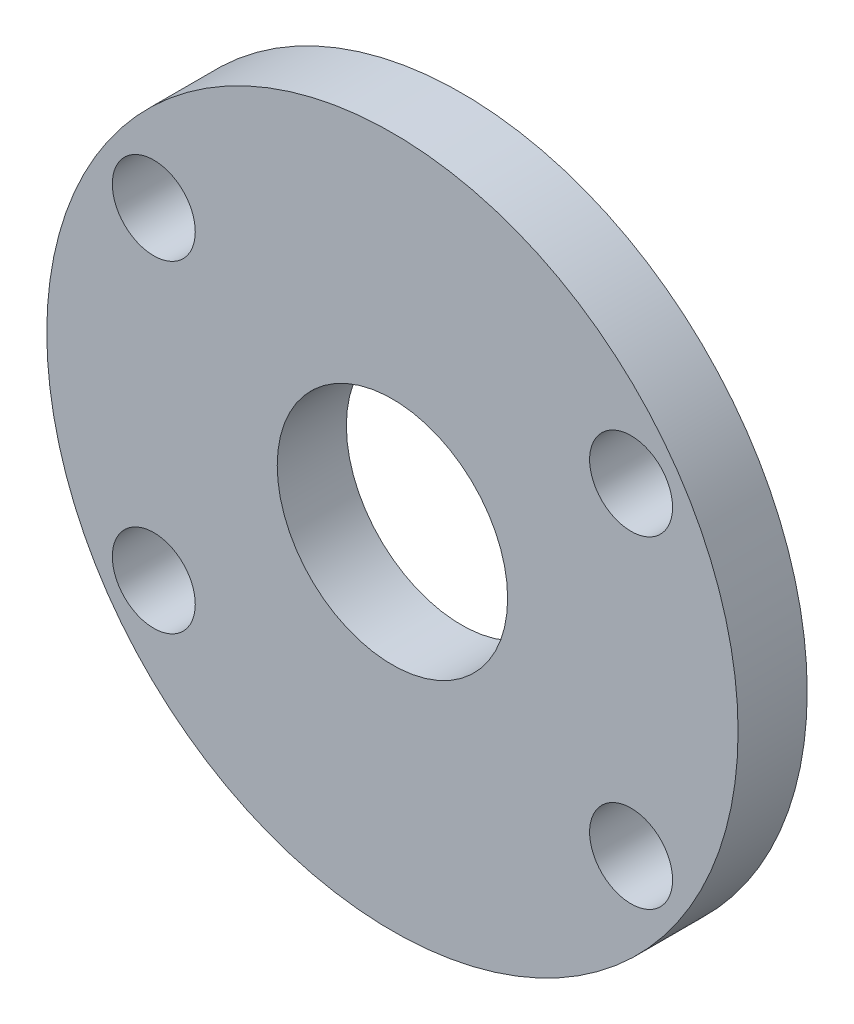
ISO-10303-21;
HEADER;
FILE_DESCRIPTION(('STEP AP214'),'2;1');
FILE_NAME('part.step','',(''),(''),'','','');
FILE_SCHEMA(('AUTOMOTIVE_DESIGN { 1 0 10303 214 1 1 1 1 }'));
ENDSEC;
DATA;
#1=APPLICATION_CONTEXT('core data for automotive mechanical design processes');
#2=APPLICATION_PROTOCOL_DEFINITION('international standard','automotive_design',2000,#1);
#3=PRODUCT_CONTEXT('',#1,'mechanical');
#4=PRODUCT('Part','Part','',(#3));
#5=PRODUCT_RELATED_PRODUCT_CATEGORY('part','',(#4));
#6=PRODUCT_DEFINITION_FORMATION('','',#4);
#7=PRODUCT_DEFINITION_CONTEXT('part definition',#1,'design');
#8=PRODUCT_DEFINITION('design','',#6,#7);
#9=PRODUCT_DEFINITION_SHAPE('','',#8);
#10=(LENGTH_UNIT() NAMED_UNIT(*) SI_UNIT(.MILLI.,.METRE.));
#11=(NAMED_UNIT(*) PLANE_ANGLE_UNIT() SI_UNIT($,.RADIAN.));
#12=(NAMED_UNIT(*) SI_UNIT($,.STERADIAN.) SOLID_ANGLE_UNIT());
#13=UNCERTAINTY_MEASURE_WITH_UNIT(LENGTH_MEASURE(1.E-05),#10,'distance_accuracy_value','');
#14=(GEOMETRIC_REPRESENTATION_CONTEXT(3) GLOBAL_UNCERTAINTY_ASSIGNED_CONTEXT((#13)) GLOBAL_UNIT_ASSIGNED_CONTEXT((#10,
#11,#12)) REPRESENTATION_CONTEXT('',''));
#15=CARTESIAN_POINT('',(0.,0.,0.));
#16=DIRECTION('',(0.,0.,1.));
#17=DIRECTION('',(1.,0.,0.));
#18=AXIS2_PLACEMENT_3D('',#15,#16,#17);
#19=CARTESIAN_POINT('',(0.,0.,3.));
#20=DIRECTION('',(0.,0.,-1.));
#21=DIRECTION('',(-1.,0.,0.));
#22=AXIS2_PLACEMENT_3D('',#19,#20,#21);
#23=CYLINDRICAL_SURFACE('',#22,15.);
#24=CARTESIAN_POINT('',(0.,0.,3.));
#25=DIRECTION('',(0.,0.,1.));
#26=DIRECTION('',(1.,0.,0.));
#27=AXIS2_PLACEMENT_3D('',#24,#25,#26);
#28=CIRCLE('',#27,15.);
#29=CARTESIAN_POINT('',(15.,0.,3.));
#30=VERTEX_POINT('',#29);
#31=EDGE_CURVE('E10',#30,#30,#28,.T.);
#32=ORIENTED_EDGE('',*,*,#31,.F.);
#33=EDGE_LOOP('',(#32));
#34=FACE_BOUND('',#33,.T.);
#35=CARTESIAN_POINT('',(0.,0.,0.));
#36=DIRECTION('',(0.,0.,1.));
#37=DIRECTION('',(1.,0.,0.));
#38=AXIS2_PLACEMENT_3D('',#35,#36,#37);
#39=CIRCLE('',#38,15.);
#40=CARTESIAN_POINT('',(15.,0.,0.));
#41=VERTEX_POINT('',#40);
#42=EDGE_CURVE('E36',#41,#41,#39,.T.);
#43=ORIENTED_EDGE('',*,*,#42,.T.);
#44=EDGE_LOOP('',(#43));
#45=FACE_BOUND('',#44,.T.);
#46=ADVANCED_FACE('F33',(#34,#45),#23,.T.);
#47=CARTESIAN_POINT('',(0.,0.,3.));
#48=DIRECTION('',(0.,0.,1.));
#49=DIRECTION('',(1.,0.,0.));
#50=AXIS2_PLACEMENT_3D('',#47,#48,#49);
#51=PLANE('',#50);
#52=CARTESIAN_POINT('',(-10.356157588604,7.,3.));
#53=DIRECTION('',(0.,0.,1.));
#54=DIRECTION('',(-1.,0.,0.));
#55=AXIS2_PLACEMENT_3D('',#52,#53,#54);
#56=CIRCLE('',#55,1.8);
#57=CARTESIAN_POINT('',(-8.55615758860399,7.,3.));
#58=VERTEX_POINT('',#57);
#59=EDGE_CURVE('E61',#58,#58,#56,.T.);
#60=ORIENTED_EDGE('',*,*,#59,.F.);
#61=EDGE_LOOP('',(#60));
#62=FACE_BOUND('',#61,.T.);
#63=CARTESIAN_POINT('',(10.356157588604,7.,3.));
#64=DIRECTION('',(0.,0.,1.));
#65=DIRECTION('',(-1.,0.,0.));
#66=AXIS2_PLACEMENT_3D('',#63,#64,#65);
#67=CIRCLE('',#66,1.8);
#68=CARTESIAN_POINT('',(12.156157588604,7.,3.));
#69=VERTEX_POINT('',#68);
#70=EDGE_CURVE('E60',#69,#69,#67,.T.);
#71=ORIENTED_EDGE('',*,*,#70,.F.);
#72=EDGE_LOOP('',(#71));
#73=FACE_BOUND('',#72,.T.);
#74=CARTESIAN_POINT('',(10.356157588604,-7.,3.));
#75=DIRECTION('',(0.,0.,1.));
#76=DIRECTION('',(1.,0.,0.));
#77=AXIS2_PLACEMENT_3D('',#74,#75,#76);
#78=CIRCLE('',#77,1.8);
#79=CARTESIAN_POINT('',(12.156157588604,-7.,3.));
#80=VERTEX_POINT('',#79);
#81=EDGE_CURVE('E67',#80,#80,#78,.T.);
#82=ORIENTED_EDGE('',*,*,#81,.F.);
#83=EDGE_LOOP('',(#82));
#84=FACE_BOUND('',#83,.T.);
#85=CARTESIAN_POINT('',(-10.356157588604,-7.,3.));
#86=DIRECTION('',(0.,0.,1.));
#87=DIRECTION('',(1.,0.,0.));
#88=AXIS2_PLACEMENT_3D('',#85,#86,#87);
#89=CIRCLE('',#88,1.8);
#90=CARTESIAN_POINT('',(-8.55615758860399,-7.,3.));
#91=VERTEX_POINT('',#90);
#92=EDGE_CURVE('E53',#91,#91,#89,.T.);
#93=ORIENTED_EDGE('',*,*,#92,.F.);
#94=EDGE_LOOP('',(#93));
#95=FACE_BOUND('',#94,.T.);
#96=CARTESIAN_POINT('',(0.,0.,3.));
#97=DIRECTION('',(0.,0.,1.));
#98=DIRECTION('',(1.,0.,0.));
#99=AXIS2_PLACEMENT_3D('',#96,#97,#98);
#100=CIRCLE('',#99,5.);
#101=CARTESIAN_POINT('',(5.,0.,3.));
#102=VERTEX_POINT('',#101);
#103=EDGE_CURVE('E47',#102,#102,#100,.T.);
#104=ORIENTED_EDGE('',*,*,#103,.F.);
#105=EDGE_LOOP('',(#104));
#106=FACE_BOUND('',#105,.T.);
#107=ORIENTED_EDGE('',*,*,#31,.T.);
#108=EDGE_LOOP('',(#107));
#109=FACE_BOUND('',#108,.T.);
#110=ADVANCED_FACE('F78',(#62,#73,#84,#95,#106,#109),#51,.T.);
#111=CARTESIAN_POINT('',(0.,0.,0.));
#112=DIRECTION('',(0.,0.,1.));
#113=DIRECTION('',(1.,0.,0.));
#114=AXIS2_PLACEMENT_3D('',#111,#112,#113);
#115=PLANE('',#114);
#116=CARTESIAN_POINT('',(-10.356157588604,7.,0.));
#117=DIRECTION('',(0.,0.,1.));
#118=DIRECTION('',(1.,0.,0.));
#119=AXIS2_PLACEMENT_3D('',#116,#117,#118);
#120=CIRCLE('',#119,1.8);
#121=CARTESIAN_POINT('',(-8.55615758860399,7.,0.));
#122=VERTEX_POINT('',#121);
#123=EDGE_CURVE('E57',#122,#122,#120,.F.);
#124=ORIENTED_EDGE('',*,*,#123,.F.);
#125=EDGE_LOOP('',(#124));
#126=FACE_BOUND('',#125,.T.);
#127=CARTESIAN_POINT('',(10.356157588604,7.,0.));
#128=DIRECTION('',(0.,0.,1.));
#129=DIRECTION('',(1.,0.,0.));
#130=AXIS2_PLACEMENT_3D('',#127,#128,#129);
#131=CIRCLE('',#130,1.8);
#132=CARTESIAN_POINT('',(12.156157588604,7.,0.));
#133=VERTEX_POINT('',#132);
#134=EDGE_CURVE('E64',#133,#133,#131,.F.);
#135=ORIENTED_EDGE('',*,*,#134,.F.);
#136=EDGE_LOOP('',(#135));
#137=FACE_BOUND('',#136,.T.);
#138=CARTESIAN_POINT('',(10.356157588604,-7.,0.));
#139=DIRECTION('',(0.,0.,1.));
#140=DIRECTION('',(1.,0.,0.));
#141=AXIS2_PLACEMENT_3D('',#138,#139,#140);
#142=CIRCLE('',#141,1.8);
#143=CARTESIAN_POINT('',(12.156157588604,-7.,0.));
#144=VERTEX_POINT('',#143);
#145=EDGE_CURVE('E56',#144,#144,#142,.F.);
#146=ORIENTED_EDGE('',*,*,#145,.F.);
#147=EDGE_LOOP('',(#146));
#148=FACE_BOUND('',#147,.T.);
#149=CARTESIAN_POINT('',(-10.356157588604,-7.,0.));
#150=DIRECTION('',(0.,0.,1.));
#151=DIRECTION('',(1.,0.,0.));
#152=AXIS2_PLACEMENT_3D('',#149,#150,#151);
#153=CIRCLE('',#152,1.8);
#154=CARTESIAN_POINT('',(-8.55615758860399,-7.,0.));
#155=VERTEX_POINT('',#154);
#156=EDGE_CURVE('E50',#155,#155,#153,.F.);
#157=ORIENTED_EDGE('',*,*,#156,.F.);
#158=EDGE_LOOP('',(#157));
#159=FACE_BOUND('',#158,.T.);
#160=CARTESIAN_POINT('',(0.,0.,0.));
#161=DIRECTION('',(0.,0.,1.));
#162=DIRECTION('',(1.,0.,0.));
#163=AXIS2_PLACEMENT_3D('',#160,#161,#162);
#164=CIRCLE('',#163,5.);
#165=CARTESIAN_POINT('',(5.,0.,0.));
#166=VERTEX_POINT('',#165);
#167=EDGE_CURVE('E43',#166,#166,#164,.F.);
#168=ORIENTED_EDGE('',*,*,#167,.F.);
#169=EDGE_LOOP('',(#168));
#170=FACE_BOUND('',#169,.T.);
#171=ORIENTED_EDGE('',*,*,#42,.F.);
#172=EDGE_LOOP('',(#171));
#173=FACE_BOUND('',#172,.T.);
#174=ADVANCED_FACE('F81',(#126,#137,#148,#159,#170,#173),#115,.F.);
#175=CARTESIAN_POINT('',(0.,0.,-0.00100000000000013));
#176=DIRECTION('',(0.,0.,1.));
#177=DIRECTION('',(1.,0.,0.));
#178=AXIS2_PLACEMENT_3D('',#175,#176,#177);
#179=CYLINDRICAL_SURFACE('',#178,5.);
#180=CARTESIAN_POINT('',(5.,0.,3.));
#181=CARTESIAN_POINT('',(5.,0.,2.96875));
#182=CARTESIAN_POINT('',(5.,0.,2.9375));
#183=CARTESIAN_POINT('',(5.,0.,2.875));
#184=CARTESIAN_POINT('',(5.,0.,2.84375));
#185=CARTESIAN_POINT('',(5.,0.,2.78125));
#186=CARTESIAN_POINT('',(5.,0.,2.75));
#187=CARTESIAN_POINT('',(5.,0.,2.6875));
#188=CARTESIAN_POINT('',(5.,0.,2.65625));
#189=CARTESIAN_POINT('',(5.,0.,2.59375));
#190=CARTESIAN_POINT('',(5.,0.,2.5625));
#191=CARTESIAN_POINT('',(5.,0.,2.5));
#192=CARTESIAN_POINT('',(5.,0.,2.46875));
#193=CARTESIAN_POINT('',(5.,0.,2.40625));
#194=CARTESIAN_POINT('',(5.,0.,2.375));
#195=CARTESIAN_POINT('',(5.,0.,2.3125));
#196=CARTESIAN_POINT('',(5.,0.,2.28125));
#197=CARTESIAN_POINT('',(5.,0.,2.21875));
#198=CARTESIAN_POINT('',(5.,0.,2.1875));
#199=CARTESIAN_POINT('',(5.,0.,2.125));
#200=CARTESIAN_POINT('',(5.,0.,2.09375));
#201=CARTESIAN_POINT('',(5.,0.,2.03125));
#202=CARTESIAN_POINT('',(5.,0.,2.));
#203=CARTESIAN_POINT('',(5.,0.,1.9375));
#204=CARTESIAN_POINT('',(5.,0.,1.90625));
#205=CARTESIAN_POINT('',(5.,0.,1.84375));
#206=CARTESIAN_POINT('',(5.,0.,1.8125));
#207=CARTESIAN_POINT('',(5.,0.,1.75));
#208=CARTESIAN_POINT('',(5.,0.,1.71875));
#209=CARTESIAN_POINT('',(5.,0.,1.65625));
#210=CARTESIAN_POINT('',(5.,0.,1.625));
#211=CARTESIAN_POINT('',(5.,0.,1.5625));
#212=CARTESIAN_POINT('',(5.,0.,1.53125));
#213=CARTESIAN_POINT('',(5.,0.,1.46875));
#214=CARTESIAN_POINT('',(5.,0.,1.4375));
#215=CARTESIAN_POINT('',(5.,0.,1.375));
#216=CARTESIAN_POINT('',(5.,0.,1.34375));
#217=CARTESIAN_POINT('',(5.,0.,1.28125));
#218=CARTESIAN_POINT('',(5.,0.,1.25));
#219=CARTESIAN_POINT('',(5.,0.,1.1875));
#220=CARTESIAN_POINT('',(5.,0.,1.15625));
#221=CARTESIAN_POINT('',(5.,0.,1.09375));
#222=CARTESIAN_POINT('',(5.,0.,1.0625));
#223=CARTESIAN_POINT('',(5.,0.,1.));
#224=CARTESIAN_POINT('',(5.,0.,0.96875));
#225=CARTESIAN_POINT('',(5.,0.,0.90625));
#226=CARTESIAN_POINT('',(5.,0.,0.875));
#227=CARTESIAN_POINT('',(5.,0.,0.8125));
#228=CARTESIAN_POINT('',(5.,0.,0.78125));
#229=CARTESIAN_POINT('',(5.,0.,0.71875));
#230=CARTESIAN_POINT('',(5.,0.,0.6875));
#231=CARTESIAN_POINT('',(5.,0.,0.625));
#232=CARTESIAN_POINT('',(5.,0.,0.59375));
#233=CARTESIAN_POINT('',(5.,0.,0.53125));
#234=CARTESIAN_POINT('',(5.,0.,0.5));
#235=CARTESIAN_POINT('',(5.,0.,0.4375));
#236=CARTESIAN_POINT('',(5.,0.,0.40625));
#237=CARTESIAN_POINT('',(5.,0.,0.34375));
#238=CARTESIAN_POINT('',(5.,0.,0.3125));
#239=CARTESIAN_POINT('',(5.,0.,0.25));
#240=CARTESIAN_POINT('',(5.,0.,0.21875));
#241=CARTESIAN_POINT('',(5.,0.,0.15625));
#242=CARTESIAN_POINT('',(5.,0.,0.125));
#243=CARTESIAN_POINT('',(5.,0.,0.0625000000000001));
#244=CARTESIAN_POINT('',(5.,0.,0.0312500000000001));
#245=CARTESIAN_POINT('',(5.,0.,0.));
#246=B_SPLINE_CURVE_WITH_KNOTS('',3,(#180,#181,#182,#183,#184,#185,#186,#187,#188,#189,#190,
#191,#192,#193,#194,#195,#196,#197,#198,#199,#200,#201,#202,#203,#204,#205,#206,#207,#208,#209,
#210,#211,#212,#213,#214,#215,#216,#217,#218,#219,#220,#221,#222,#223,#224,#225,#226,#227,#228,
#229,#230,#231,#232,#233,#234,#235,#236,#237,#238,#239,#240,#241,#242,#243,#244,#245),
.UNSPECIFIED.,.F.,.F.,(4,2,2,2,2,2,2,2,2,2,2,2,2,2,2,2,2,2,2,2,2,2,2,2,2,2,2,2,2,2,2,2,4),(0.,
0.0937500000000001,0.1875,0.28125,0.375,0.46875,0.5625,0.65625,0.75,0.84375,0.9375,1.03125,
1.125,1.21875,1.3125,1.40625,1.5,1.59375,1.6875,1.78125,1.875,1.96875,2.0625,2.15625,2.25,
2.34375,2.4375,2.53125,2.625,2.71875,2.8125,2.90625,3.),.UNSPECIFIED.);
#247=EDGE_CURVE('BSEAM88',#102,#166,#246,.T.);
#248=ORIENTED_EDGE('',*,*,#103,.T.);
#249=ORIENTED_EDGE('',*,*,#167,.T.);
#250=ORIENTED_EDGE('',*,*,#247,.T.);
#251=ORIENTED_EDGE('',*,*,#247,.F.);
#252=EDGE_LOOP('',(#248,#250,#249,#251));
#253=FACE_BOUND('',#252,.T.);
#254=ADVANCED_FACE('F88',(#253),#179,.F.);
#255=CARTESIAN_POINT('',(-10.356157588604,-7.,-0.00100000000000013));
#256=DIRECTION('',(0.,0.,1.));
#257=DIRECTION('',(1.,0.,0.));
#258=AXIS2_PLACEMENT_3D('',#255,#256,#257);
#259=CYLINDRICAL_SURFACE('',#258,1.8);
#260=CARTESIAN_POINT('',(-8.55615758860399,-7.,3.));
#261=CARTESIAN_POINT('',(-8.55615758860399,-7.,2.96875));
#262=CARTESIAN_POINT('',(-8.55615758860399,-7.,2.9375));
#263=CARTESIAN_POINT('',(-8.55615758860399,-7.,2.875));
#264=CARTESIAN_POINT('',(-8.55615758860399,-7.,2.84375));
#265=CARTESIAN_POINT('',(-8.55615758860399,-7.,2.78125));
#266=CARTESIAN_POINT('',(-8.55615758860399,-7.,2.75));
#267=CARTESIAN_POINT('',(-8.55615758860399,-7.,2.6875));
#268=CARTESIAN_POINT('',(-8.55615758860399,-7.,2.65625));
#269=CARTESIAN_POINT('',(-8.55615758860399,-7.,2.59375));
#270=CARTESIAN_POINT('',(-8.55615758860399,-7.,2.5625));
#271=CARTESIAN_POINT('',(-8.55615758860399,-7.,2.5));
#272=CARTESIAN_POINT('',(-8.55615758860399,-7.,2.46875));
#273=CARTESIAN_POINT('',(-8.55615758860399,-7.,2.40625));
#274=CARTESIAN_POINT('',(-8.55615758860399,-7.,2.375));
#275=CARTESIAN_POINT('',(-8.55615758860399,-7.,2.3125));
#276=CARTESIAN_POINT('',(-8.55615758860399,-7.,2.28125));
#277=CARTESIAN_POINT('',(-8.55615758860399,-7.,2.21875));
#278=CARTESIAN_POINT('',(-8.55615758860399,-7.,2.1875));
#279=CARTESIAN_POINT('',(-8.55615758860399,-7.,2.125));
#280=CARTESIAN_POINT('',(-8.55615758860399,-7.,2.09375));
#281=CARTESIAN_POINT('',(-8.55615758860399,-7.,2.03125));
#282=CARTESIAN_POINT('',(-8.55615758860399,-7.,2.));
#283=CARTESIAN_POINT('',(-8.55615758860399,-7.,1.9375));
#284=CARTESIAN_POINT('',(-8.55615758860399,-7.,1.90625));
#285=CARTESIAN_POINT('',(-8.55615758860399,-7.,1.84375));
#286=CARTESIAN_POINT('',(-8.55615758860399,-7.,1.8125));
#287=CARTESIAN_POINT('',(-8.55615758860399,-7.,1.75));
#288=CARTESIAN_POINT('',(-8.55615758860399,-7.,1.71875));
#289=CARTESIAN_POINT('',(-8.55615758860399,-7.,1.65625));
#290=CARTESIAN_POINT('',(-8.55615758860399,-7.,1.625));
#291=CARTESIAN_POINT('',(-8.55615758860399,-7.,1.5625));
#292=CARTESIAN_POINT('',(-8.55615758860399,-7.,1.53125));
#293=CARTESIAN_POINT('',(-8.55615758860399,-7.,1.46875));
#294=CARTESIAN_POINT('',(-8.55615758860399,-7.,1.4375));
#295=CARTESIAN_POINT('',(-8.55615758860399,-7.,1.375));
#296=CARTESIAN_POINT('',(-8.55615758860399,-7.,1.34375));
#297=CARTESIAN_POINT('',(-8.55615758860399,-7.,1.28125));
#298=CARTESIAN_POINT('',(-8.55615758860399,-7.,1.25));
#299=CARTESIAN_POINT('',(-8.55615758860399,-7.,1.1875));
#300=CARTESIAN_POINT('',(-8.55615758860399,-7.,1.15625));
#301=CARTESIAN_POINT('',(-8.55615758860399,-7.,1.09375));
#302=CARTESIAN_POINT('',(-8.55615758860399,-7.,1.0625));
#303=CARTESIAN_POINT('',(-8.55615758860399,-7.,1.));
#304=CARTESIAN_POINT('',(-8.55615758860399,-7.,0.96875));
#305=CARTESIAN_POINT('',(-8.55615758860399,-7.,0.90625));
#306=CARTESIAN_POINT('',(-8.55615758860399,-7.,0.875));
#307=CARTESIAN_POINT('',(-8.55615758860399,-7.,0.8125));
#308=CARTESIAN_POINT('',(-8.55615758860399,-7.,0.78125));
#309=CARTESIAN_POINT('',(-8.55615758860399,-7.,0.71875));
#310=CARTESIAN_POINT('',(-8.55615758860399,-7.,0.6875));
#311=CARTESIAN_POINT('',(-8.55615758860399,-7.,0.625));
#312=CARTESIAN_POINT('',(-8.55615758860399,-7.,0.59375));
#313=CARTESIAN_POINT('',(-8.55615758860399,-7.,0.53125));
#314=CARTESIAN_POINT('',(-8.55615758860399,-7.,0.5));
#315=CARTESIAN_POINT('',(-8.55615758860399,-7.,0.4375));
#316=CARTESIAN_POINT('',(-8.55615758860399,-7.,0.40625));
#317=CARTESIAN_POINT('',(-8.55615758860399,-7.,0.34375));
#318=CARTESIAN_POINT('',(-8.55615758860399,-7.,0.3125));
#319=CARTESIAN_POINT('',(-8.55615758860399,-7.,0.25));
#320=CARTESIAN_POINT('',(-8.55615758860399,-7.,0.21875));
#321=CARTESIAN_POINT('',(-8.55615758860399,-7.,0.15625));
#322=CARTESIAN_POINT('',(-8.55615758860399,-7.,0.125));
#323=CARTESIAN_POINT('',(-8.55615758860399,-7.,0.0625000000000001));
#324=CARTESIAN_POINT('',(-8.55615758860399,-7.,0.0312500000000001));
#325=CARTESIAN_POINT('',(-8.55615758860399,-7.,0.));
#326=B_SPLINE_CURVE_WITH_KNOTS('',3,(#260,#261,#262,#263,#264,#265,#266,#267,#268,#269,#270,
#271,#272,#273,#274,#275,#276,#277,#278,#279,#280,#281,#282,#283,#284,#285,#286,#287,#288,#289,
#290,#291,#292,#293,#294,#295,#296,#297,#298,#299,#300,#301,#302,#303,#304,#305,#306,#307,#308,
#309,#310,#311,#312,#313,#314,#315,#316,#317,#318,#319,#320,#321,#322,#323,#324,#325),
.UNSPECIFIED.,.F.,.F.,(4,2,2,2,2,2,2,2,2,2,2,2,2,2,2,2,2,2,2,2,2,2,2,2,2,2,2,2,2,2,2,2,4),(0.,
0.0937500000000001,0.1875,0.28125,0.375,0.46875,0.5625,0.65625,0.75,0.84375,0.9375,1.03125,
1.125,1.21875,1.3125,1.40625,1.5,1.59375,1.6875,1.78125,1.875,1.96875,2.0625,2.15625,2.25,
2.34375,2.4375,2.53125,2.625,2.71875,2.8125,2.90625,3.),.UNSPECIFIED.);
#327=EDGE_CURVE('BSEAM91',#91,#155,#326,.T.);
#328=ORIENTED_EDGE('',*,*,#92,.T.);
#329=ORIENTED_EDGE('',*,*,#156,.T.);
#330=ORIENTED_EDGE('',*,*,#327,.T.);
#331=ORIENTED_EDGE('',*,*,#327,.F.);
#332=EDGE_LOOP('',(#328,#330,#329,#331));
#333=FACE_BOUND('',#332,.T.);
#334=ADVANCED_FACE('F91',(#333),#259,.F.);
#335=CARTESIAN_POINT('',(10.356157588604,-7.,-0.00100000000000013));
#336=DIRECTION('',(0.,0.,1.));
#337=DIRECTION('',(1.,0.,0.));
#338=AXIS2_PLACEMENT_3D('',#335,#336,#337);
#339=CYLINDRICAL_SURFACE('',#338,1.8);
#340=CARTESIAN_POINT('',(12.156157588604,-7.,3.));
#341=CARTESIAN_POINT('',(12.156157588604,-7.,2.96875));
#342=CARTESIAN_POINT('',(12.156157588604,-7.,2.9375));
#343=CARTESIAN_POINT('',(12.156157588604,-7.,2.875));
#344=CARTESIAN_POINT('',(12.156157588604,-7.,2.84375));
#345=CARTESIAN_POINT('',(12.156157588604,-7.,2.78125));
#346=CARTESIAN_POINT('',(12.156157588604,-7.,2.75));
#347=CARTESIAN_POINT('',(12.156157588604,-7.,2.6875));
#348=CARTESIAN_POINT('',(12.156157588604,-7.,2.65625));
#349=CARTESIAN_POINT('',(12.156157588604,-7.,2.59375));
#350=CARTESIAN_POINT('',(12.156157588604,-7.,2.5625));
#351=CARTESIAN_POINT('',(12.156157588604,-7.,2.5));
#352=CARTESIAN_POINT('',(12.156157588604,-7.,2.46875));
#353=CARTESIAN_POINT('',(12.156157588604,-7.,2.40625));
#354=CARTESIAN_POINT('',(12.156157588604,-7.,2.375));
#355=CARTESIAN_POINT('',(12.156157588604,-7.,2.3125));
#356=CARTESIAN_POINT('',(12.156157588604,-7.,2.28125));
#357=CARTESIAN_POINT('',(12.156157588604,-7.,2.21875));
#358=CARTESIAN_POINT('',(12.156157588604,-7.,2.1875));
#359=CARTESIAN_POINT('',(12.156157588604,-7.,2.125));
#360=CARTESIAN_POINT('',(12.156157588604,-7.,2.09375));
#361=CARTESIAN_POINT('',(12.156157588604,-7.,2.03125));
#362=CARTESIAN_POINT('',(12.156157588604,-7.,2.));
#363=CARTESIAN_POINT('',(12.156157588604,-7.,1.9375));
#364=CARTESIAN_POINT('',(12.156157588604,-7.,1.90625));
#365=CARTESIAN_POINT('',(12.156157588604,-7.,1.84375));
#366=CARTESIAN_POINT('',(12.156157588604,-7.,1.8125));
#367=CARTESIAN_POINT('',(12.156157588604,-7.,1.75));
#368=CARTESIAN_POINT('',(12.156157588604,-7.,1.71875));
#369=CARTESIAN_POINT('',(12.156157588604,-7.,1.65625));
#370=CARTESIAN_POINT('',(12.156157588604,-7.,1.625));
#371=CARTESIAN_POINT('',(12.156157588604,-7.,1.5625));
#372=CARTESIAN_POINT('',(12.156157588604,-7.,1.53125));
#373=CARTESIAN_POINT('',(12.156157588604,-7.,1.46875));
#374=CARTESIAN_POINT('',(12.156157588604,-7.,1.4375));
#375=CARTESIAN_POINT('',(12.156157588604,-7.,1.375));
#376=CARTESIAN_POINT('',(12.156157588604,-7.,1.34375));
#377=CARTESIAN_POINT('',(12.156157588604,-7.,1.28125));
#378=CARTESIAN_POINT('',(12.156157588604,-7.,1.25));
#379=CARTESIAN_POINT('',(12.156157588604,-7.,1.1875));
#380=CARTESIAN_POINT('',(12.156157588604,-7.,1.15625));
#381=CARTESIAN_POINT('',(12.156157588604,-7.,1.09375));
#382=CARTESIAN_POINT('',(12.156157588604,-7.,1.0625));
#383=CARTESIAN_POINT('',(12.156157588604,-7.,1.));
#384=CARTESIAN_POINT('',(12.156157588604,-7.,0.96875));
#385=CARTESIAN_POINT('',(12.156157588604,-7.,0.90625));
#386=CARTESIAN_POINT('',(12.156157588604,-7.,0.875));
#387=CARTESIAN_POINT('',(12.156157588604,-7.,0.8125));
#388=CARTESIAN_POINT('',(12.156157588604,-7.,0.78125));
#389=CARTESIAN_POINT('',(12.156157588604,-7.,0.71875));
#390=CARTESIAN_POINT('',(12.156157588604,-7.,0.6875));
#391=CARTESIAN_POINT('',(12.156157588604,-7.,0.625));
#392=CARTESIAN_POINT('',(12.156157588604,-7.,0.59375));
#393=CARTESIAN_POINT('',(12.156157588604,-7.,0.53125));
#394=CARTESIAN_POINT('',(12.156157588604,-7.,0.5));
#395=CARTESIAN_POINT('',(12.156157588604,-7.,0.4375));
#396=CARTESIAN_POINT('',(12.156157588604,-7.,0.40625));
#397=CARTESIAN_POINT('',(12.156157588604,-7.,0.34375));
#398=CARTESIAN_POINT('',(12.156157588604,-7.,0.3125));
#399=CARTESIAN_POINT('',(12.156157588604,-7.,0.25));
#400=CARTESIAN_POINT('',(12.156157588604,-7.,0.21875));
#401=CARTESIAN_POINT('',(12.156157588604,-7.,0.15625));
#402=CARTESIAN_POINT('',(12.156157588604,-7.,0.125));
#403=CARTESIAN_POINT('',(12.156157588604,-7.,0.0625000000000001));
#404=CARTESIAN_POINT('',(12.156157588604,-7.,0.0312500000000001));
#405=CARTESIAN_POINT('',(12.156157588604,-7.,0.));
#406=B_SPLINE_CURVE_WITH_KNOTS('',3,(#340,#341,#342,#343,#344,#345,#346,#347,#348,#349,#350,
#351,#352,#353,#354,#355,#356,#357,#358,#359,#360,#361,#362,#363,#364,#365,#366,#367,#368,#369,
#370,#371,#372,#373,#374,#375,#376,#377,#378,#379,#380,#381,#382,#383,#384,#385,#386,#387,#388,
#389,#390,#391,#392,#393,#394,#395,#396,#397,#398,#399,#400,#401,#402,#403,#404,#405),
.UNSPECIFIED.,.F.,.F.,(4,2,2,2,2,2,2,2,2,2,2,2,2,2,2,2,2,2,2,2,2,2,2,2,2,2,2,2,2,2,2,2,4),(0.,
0.0937500000000001,0.1875,0.28125,0.375,0.46875,0.5625,0.65625,0.75,0.84375,0.9375,1.03125,
1.125,1.21875,1.3125,1.40625,1.5,1.59375,1.6875,1.78125,1.875,1.96875,2.0625,2.15625,2.25,
2.34375,2.4375,2.53125,2.625,2.71875,2.8125,2.90625,3.),.UNSPECIFIED.);
#407=EDGE_CURVE('BSEAM75',#80,#144,#406,.T.);
#408=ORIENTED_EDGE('',*,*,#81,.T.);
#409=ORIENTED_EDGE('',*,*,#145,.T.);
#410=ORIENTED_EDGE('',*,*,#407,.T.);
#411=ORIENTED_EDGE('',*,*,#407,.F.);
#412=EDGE_LOOP('',(#408,#410,#409,#411));
#413=FACE_BOUND('',#412,.T.);
#414=ADVANCED_FACE('F75',(#413),#339,.F.);
#415=CARTESIAN_POINT('',(10.356157588604,7.,-0.00100000000000013));
#416=DIRECTION('',(0.,0.,1.));
#417=DIRECTION('',(1.,0.,0.));
#418=AXIS2_PLACEMENT_3D('',#415,#416,#417);
#419=CYLINDRICAL_SURFACE('',#418,1.8);
#420=CARTESIAN_POINT('',(12.156157588604,7.,3.));
#421=CARTESIAN_POINT('',(12.156157588604,7.,2.96875));
#422=CARTESIAN_POINT('',(12.156157588604,7.,2.9375));
#423=CARTESIAN_POINT('',(12.156157588604,7.,2.875));
#424=CARTESIAN_POINT('',(12.156157588604,7.,2.84375));
#425=CARTESIAN_POINT('',(12.156157588604,7.,2.78125));
#426=CARTESIAN_POINT('',(12.156157588604,7.,2.75));
#427=CARTESIAN_POINT('',(12.156157588604,7.,2.6875));
#428=CARTESIAN_POINT('',(12.156157588604,7.,2.65625));
#429=CARTESIAN_POINT('',(12.156157588604,7.,2.59375));
#430=CARTESIAN_POINT('',(12.156157588604,7.,2.5625));
#431=CARTESIAN_POINT('',(12.156157588604,7.,2.5));
#432=CARTESIAN_POINT('',(12.156157588604,7.,2.46875));
#433=CARTESIAN_POINT('',(12.156157588604,7.,2.40625));
#434=CARTESIAN_POINT('',(12.156157588604,7.,2.375));
#435=CARTESIAN_POINT('',(12.156157588604,7.,2.3125));
#436=CARTESIAN_POINT('',(12.156157588604,7.,2.28125));
#437=CARTESIAN_POINT('',(12.156157588604,7.,2.21875));
#438=CARTESIAN_POINT('',(12.156157588604,7.,2.1875));
#439=CARTESIAN_POINT('',(12.156157588604,7.,2.125));
#440=CARTESIAN_POINT('',(12.156157588604,7.,2.09375));
#441=CARTESIAN_POINT('',(12.156157588604,7.,2.03125));
#442=CARTESIAN_POINT('',(12.156157588604,7.,2.));
#443=CARTESIAN_POINT('',(12.156157588604,7.,1.9375));
#444=CARTESIAN_POINT('',(12.156157588604,7.,1.90625));
#445=CARTESIAN_POINT('',(12.156157588604,7.,1.84375));
#446=CARTESIAN_POINT('',(12.156157588604,7.,1.8125));
#447=CARTESIAN_POINT('',(12.156157588604,7.,1.75));
#448=CARTESIAN_POINT('',(12.156157588604,7.,1.71875));
#449=CARTESIAN_POINT('',(12.156157588604,7.,1.65625));
#450=CARTESIAN_POINT('',(12.156157588604,7.,1.625));
#451=CARTESIAN_POINT('',(12.156157588604,7.,1.5625));
#452=CARTESIAN_POINT('',(12.156157588604,7.,1.53125));
#453=CARTESIAN_POINT('',(12.156157588604,7.,1.46875));
#454=CARTESIAN_POINT('',(12.156157588604,7.,1.4375));
#455=CARTESIAN_POINT('',(12.156157588604,7.,1.375));
#456=CARTESIAN_POINT('',(12.156157588604,7.,1.34375));
#457=CARTESIAN_POINT('',(12.156157588604,7.,1.28125));
#458=CARTESIAN_POINT('',(12.156157588604,7.,1.25));
#459=CARTESIAN_POINT('',(12.156157588604,7.,1.1875));
#460=CARTESIAN_POINT('',(12.156157588604,7.,1.15625));
#461=CARTESIAN_POINT('',(12.156157588604,7.,1.09375));
#462=CARTESIAN_POINT('',(12.156157588604,7.,1.0625));
#463=CARTESIAN_POINT('',(12.156157588604,7.,1.));
#464=CARTESIAN_POINT('',(12.156157588604,7.,0.96875));
#465=CARTESIAN_POINT('',(12.156157588604,7.,0.90625));
#466=CARTESIAN_POINT('',(12.156157588604,7.,0.875));
#467=CARTESIAN_POINT('',(12.156157588604,7.,0.8125));
#468=CARTESIAN_POINT('',(12.156157588604,7.,0.78125));
#469=CARTESIAN_POINT('',(12.156157588604,7.,0.71875));
#470=CARTESIAN_POINT('',(12.156157588604,7.,0.6875));
#471=CARTESIAN_POINT('',(12.156157588604,7.,0.625));
#472=CARTESIAN_POINT('',(12.156157588604,7.,0.59375));
#473=CARTESIAN_POINT('',(12.156157588604,7.,0.53125));
#474=CARTESIAN_POINT('',(12.156157588604,7.,0.5));
#475=CARTESIAN_POINT('',(12.156157588604,7.,0.4375));
#476=CARTESIAN_POINT('',(12.156157588604,7.,0.40625));
#477=CARTESIAN_POINT('',(12.156157588604,7.,0.34375));
#478=CARTESIAN_POINT('',(12.156157588604,7.,0.3125));
#479=CARTESIAN_POINT('',(12.156157588604,7.,0.25));
#480=CARTESIAN_POINT('',(12.156157588604,7.,0.21875));
#481=CARTESIAN_POINT('',(12.156157588604,7.,0.15625));
#482=CARTESIAN_POINT('',(12.156157588604,7.,0.125));
#483=CARTESIAN_POINT('',(12.156157588604,7.,0.0625000000000001));
#484=CARTESIAN_POINT('',(12.156157588604,7.,0.0312500000000001));
#485=CARTESIAN_POINT('',(12.156157588604,7.,0.));
#486=B_SPLINE_CURVE_WITH_KNOTS('',3,(#420,#421,#422,#423,#424,#425,#426,#427,#428,#429,#430,
#431,#432,#433,#434,#435,#436,#437,#438,#439,#440,#441,#442,#443,#444,#445,#446,#447,#448,#449,
#450,#451,#452,#453,#454,#455,#456,#457,#458,#459,#460,#461,#462,#463,#464,#465,#466,#467,#468,
#469,#470,#471,#472,#473,#474,#475,#476,#477,#478,#479,#480,#481,#482,#483,#484,#485),
.UNSPECIFIED.,.F.,.F.,(4,2,2,2,2,2,2,2,2,2,2,2,2,2,2,2,2,2,2,2,2,2,2,2,2,2,2,2,2,2,2,2,4),(0.,
0.0937500000000001,0.1875,0.28125,0.375,0.46875,0.5625,0.65625,0.75,0.84375,0.9375,1.03125,
1.125,1.21875,1.3125,1.40625,1.5,1.59375,1.6875,1.78125,1.875,1.96875,2.0625,2.15625,2.25,
2.34375,2.4375,2.53125,2.625,2.71875,2.8125,2.90625,3.),.UNSPECIFIED.);
#487=EDGE_CURVE('BSEAM129',#69,#133,#486,.T.);
#488=ORIENTED_EDGE('',*,*,#70,.T.);
#489=ORIENTED_EDGE('',*,*,#134,.T.);
#490=ORIENTED_EDGE('',*,*,#487,.T.);
#491=ORIENTED_EDGE('',*,*,#487,.F.);
#492=EDGE_LOOP('',(#488,#490,#489,#491));
#493=FACE_BOUND('',#492,.T.);
#494=ADVANCED_FACE('F129',(#493),#419,.F.);
#495=CARTESIAN_POINT('',(-10.356157588604,7.,-0.00100000000000013));
#496=DIRECTION('',(0.,0.,1.));
#497=DIRECTION('',(1.,0.,0.));
#498=AXIS2_PLACEMENT_3D('',#495,#496,#497);
#499=CYLINDRICAL_SURFACE('',#498,1.8);
#500=CARTESIAN_POINT('',(-8.55615758860399,7.,3.));
#501=CARTESIAN_POINT('',(-8.55615758860399,7.,2.96875));
#502=CARTESIAN_POINT('',(-8.55615758860399,7.,2.9375));
#503=CARTESIAN_POINT('',(-8.55615758860399,7.,2.875));
#504=CARTESIAN_POINT('',(-8.55615758860399,7.,2.84375));
#505=CARTESIAN_POINT('',(-8.55615758860399,7.,2.78125));
#506=CARTESIAN_POINT('',(-8.55615758860399,7.,2.75));
#507=CARTESIAN_POINT('',(-8.55615758860399,7.,2.6875));
#508=CARTESIAN_POINT('',(-8.55615758860399,7.,2.65625));
#509=CARTESIAN_POINT('',(-8.55615758860399,7.,2.59375));
#510=CARTESIAN_POINT('',(-8.55615758860399,7.,2.5625));
#511=CARTESIAN_POINT('',(-8.55615758860399,7.,2.5));
#512=CARTESIAN_POINT('',(-8.55615758860399,7.,2.46875));
#513=CARTESIAN_POINT('',(-8.55615758860399,7.,2.40625));
#514=CARTESIAN_POINT('',(-8.55615758860399,7.,2.375));
#515=CARTESIAN_POINT('',(-8.55615758860399,7.,2.3125));
#516=CARTESIAN_POINT('',(-8.55615758860399,7.,2.28125));
#517=CARTESIAN_POINT('',(-8.55615758860399,7.,2.21875));
#518=CARTESIAN_POINT('',(-8.55615758860399,7.,2.1875));
#519=CARTESIAN_POINT('',(-8.55615758860399,7.,2.125));
#520=CARTESIAN_POINT('',(-8.55615758860399,7.,2.09375));
#521=CARTESIAN_POINT('',(-8.55615758860399,7.,2.03125));
#522=CARTESIAN_POINT('',(-8.55615758860399,7.,2.));
#523=CARTESIAN_POINT('',(-8.55615758860399,7.,1.9375));
#524=CARTESIAN_POINT('',(-8.55615758860399,7.,1.90625));
#525=CARTESIAN_POINT('',(-8.55615758860399,7.,1.84375));
#526=CARTESIAN_POINT('',(-8.55615758860399,7.,1.8125));
#527=CARTESIAN_POINT('',(-8.55615758860399,7.,1.75));
#528=CARTESIAN_POINT('',(-8.55615758860399,7.,1.71875));
#529=CARTESIAN_POINT('',(-8.55615758860399,7.,1.65625));
#530=CARTESIAN_POINT('',(-8.55615758860399,7.,1.625));
#531=CARTESIAN_POINT('',(-8.55615758860399,7.,1.5625));
#532=CARTESIAN_POINT('',(-8.55615758860399,7.,1.53125));
#533=CARTESIAN_POINT('',(-8.55615758860399,7.,1.46875));
#534=CARTESIAN_POINT('',(-8.55615758860399,7.,1.4375));
#535=CARTESIAN_POINT('',(-8.55615758860399,7.,1.375));
#536=CARTESIAN_POINT('',(-8.55615758860399,7.,1.34375));
#537=CARTESIAN_POINT('',(-8.55615758860399,7.,1.28125));
#538=CARTESIAN_POINT('',(-8.55615758860399,7.,1.25));
#539=CARTESIAN_POINT('',(-8.55615758860399,7.,1.1875));
#540=CARTESIAN_POINT('',(-8.55615758860399,7.,1.15625));
#541=CARTESIAN_POINT('',(-8.55615758860399,7.,1.09375));
#542=CARTESIAN_POINT('',(-8.55615758860399,7.,1.0625));
#543=CARTESIAN_POINT('',(-8.55615758860399,7.,1.));
#544=CARTESIAN_POINT('',(-8.55615758860399,7.,0.96875));
#545=CARTESIAN_POINT('',(-8.55615758860399,7.,0.90625));
#546=CARTESIAN_POINT('',(-8.55615758860399,7.,0.875));
#547=CARTESIAN_POINT('',(-8.55615758860399,7.,0.8125));
#548=CARTESIAN_POINT('',(-8.55615758860399,7.,0.78125));
#549=CARTESIAN_POINT('',(-8.55615758860399,7.,0.71875));
#550=CARTESIAN_POINT('',(-8.55615758860399,7.,0.6875));
#551=CARTESIAN_POINT('',(-8.55615758860399,7.,0.625));
#552=CARTESIAN_POINT('',(-8.55615758860399,7.,0.59375));
#553=CARTESIAN_POINT('',(-8.55615758860399,7.,0.53125));
#554=CARTESIAN_POINT('',(-8.55615758860399,7.,0.5));
#555=CARTESIAN_POINT('',(-8.55615758860399,7.,0.4375));
#556=CARTESIAN_POINT('',(-8.55615758860399,7.,0.40625));
#557=CARTESIAN_POINT('',(-8.55615758860399,7.,0.34375));
#558=CARTESIAN_POINT('',(-8.55615758860399,7.,0.3125));
#559=CARTESIAN_POINT('',(-8.55615758860399,7.,0.25));
#560=CARTESIAN_POINT('',(-8.55615758860399,7.,0.21875));
#561=CARTESIAN_POINT('',(-8.55615758860399,7.,0.15625));
#562=CARTESIAN_POINT('',(-8.55615758860399,7.,0.125));
#563=CARTESIAN_POINT('',(-8.55615758860399,7.,0.0625000000000001));
#564=CARTESIAN_POINT('',(-8.55615758860399,7.,0.0312500000000001));
#565=CARTESIAN_POINT('',(-8.55615758860399,7.,0.));
#566=B_SPLINE_CURVE_WITH_KNOTS('',3,(#500,#501,#502,#503,#504,#505,#506,#507,#508,#509,#510,
#511,#512,#513,#514,#515,#516,#517,#518,#519,#520,#521,#522,#523,#524,#525,#526,#527,#528,#529,
#530,#531,#532,#533,#534,#535,#536,#537,#538,#539,#540,#541,#542,#543,#544,#545,#546,#547,#548,
#549,#550,#551,#552,#553,#554,#555,#556,#557,#558,#559,#560,#561,#562,#563,#564,#565),
.UNSPECIFIED.,.F.,.F.,(4,2,2,2,2,2,2,2,2,2,2,2,2,2,2,2,2,2,2,2,2,2,2,2,2,2,2,2,2,2,2,2,4),(0.,
0.0937500000000001,0.1875,0.28125,0.375,0.46875,0.5625,0.65625,0.75,0.84375,0.9375,1.03125,
1.125,1.21875,1.3125,1.40625,1.5,1.59375,1.6875,1.78125,1.875,1.96875,2.0625,2.15625,2.25,
2.34375,2.4375,2.53125,2.625,2.71875,2.8125,2.90625,3.),.UNSPECIFIED.);
#567=EDGE_CURVE('BSEAM136',#58,#122,#566,.T.);
#568=ORIENTED_EDGE('',*,*,#59,.T.);
#569=ORIENTED_EDGE('',*,*,#123,.T.);
#570=ORIENTED_EDGE('',*,*,#567,.T.);
#571=ORIENTED_EDGE('',*,*,#567,.F.);
#572=EDGE_LOOP('',(#568,#570,#569,#571));
#573=FACE_BOUND('',#572,.T.);
#574=ADVANCED_FACE('F136',(#573),#499,.F.);
#575=CLOSED_SHELL('',(#46,#110,#174,#254,#334,#414,#494,#574));
#576=MANIFOLD_SOLID_BREP('B2',#575);
#577=ADVANCED_BREP_SHAPE_REPRESENTATION('',(#18,#576),#14);
#578=SHAPE_DEFINITION_REPRESENTATION(#9,#577);
ENDSEC;
END-ISO-10303-21;
